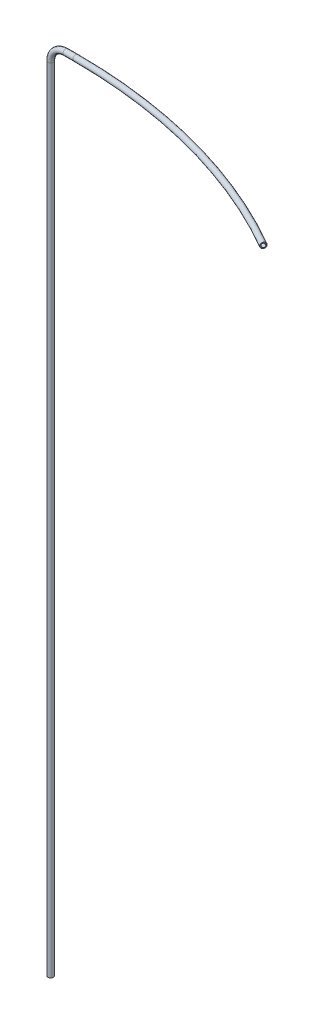
ISO-10303-21;
HEADER;
FILE_DESCRIPTION(('STEP AP214'),'2;1');
FILE_NAME('part.step','',(''),(''),'','','');
FILE_SCHEMA(('AUTOMOTIVE_DESIGN { 1 0 10303 214 1 1 1 1 }'));
ENDSEC;
DATA;
#1=APPLICATION_CONTEXT('core data for automotive mechanical design processes');
#2=APPLICATION_PROTOCOL_DEFINITION('international standard','automotive_design',2000,#1);
#3=PRODUCT_CONTEXT('',#1,'mechanical');
#4=PRODUCT('Part','Part','',(#3));
#5=PRODUCT_RELATED_PRODUCT_CATEGORY('part','',(#4));
#6=PRODUCT_DEFINITION_FORMATION('','',#4);
#7=PRODUCT_DEFINITION_CONTEXT('part definition',#1,'design');
#8=PRODUCT_DEFINITION('design','',#6,#7);
#9=PRODUCT_DEFINITION_SHAPE('','',#8);
#10=(LENGTH_UNIT() NAMED_UNIT(*) SI_UNIT(.MILLI.,.METRE.));
#11=(NAMED_UNIT(*) PLANE_ANGLE_UNIT() SI_UNIT($,.RADIAN.));
#12=(NAMED_UNIT(*) SI_UNIT($,.STERADIAN.) SOLID_ANGLE_UNIT());
#13=UNCERTAINTY_MEASURE_WITH_UNIT(LENGTH_MEASURE(1.E-05),#10,'distance_accuracy_value','');
#14=(GEOMETRIC_REPRESENTATION_CONTEXT(3) GLOBAL_UNCERTAINTY_ASSIGNED_CONTEXT((#13)) GLOBAL_UNIT_ASSIGNED_CONTEXT((#10,
#11,#12)) REPRESENTATION_CONTEXT('',''));
#15=CARTESIAN_POINT('',(0.,0.,0.));
#16=DIRECTION('',(0.,0.,1.));
#17=DIRECTION('',(1.,0.,0.));
#18=AXIS2_PLACEMENT_3D('',#15,#16,#17);
#19=CARTESIAN_POINT('',(0.,-0.371055821718923,-200.));
#20=DIRECTION('',(0.,1.,0.));
#21=DIRECTION('',(0.,0.,1.));
#22=AXIS2_PLACEMENT_3D('',#19,#20,#21);
#23=TOROIDAL_SURFACE('',#22,1100.,6.0000000000001);
#24=CARTESIAN_POINT('',(550.000000000001,-0.371055821718923,-1152.62794416288));
#25=DIRECTION('',(0.866025403784438,0.,0.500000000000001));
#26=DIRECTION('',(0.500000000000001,0.,-0.866025403784438));
#27=AXIS2_PLACEMENT_3D('',#24,#25,#26);
#28=CIRCLE('',#27,6.0000000000001);
#29=CARTESIAN_POINT('',(553.000000000001,-0.371055821718923,-1157.82409658559));
#30=VERTEX_POINT('',#29);
#31=EDGE_CURVE('E49',#30,#30,#28,.T.);
#32=CARTESIAN_POINT('',(0.,-0.371055821718923,-1300.));
#33=DIRECTION('',(-1.,0.,0.));
#34=DIRECTION('',(0.,0.,1.));
#35=AXIS2_PLACEMENT_3D('',#32,#33,#34);
#36=CIRCLE('',#35,6.0000000000001);
#37=CARTESIAN_POINT('',(0.,-0.371055821718923,-1306.));
#38=VERTEX_POINT('',#37);
#39=EDGE_CURVE('E66',#38,#38,#36,.T.);
#40=CARTESIAN_POINT('',(0.,-0.371055821718923,-200.));
#41=DIRECTION('',(0.,1.,0.));
#42=DIRECTION('',(0.,0.,1.));
#43=AXIS2_PLACEMENT_3D('',#40,#41,#42);
#44=CIRCLE('',#43,1106.);
#45=EDGE_CURVE('',#30,#38,#44,.T.);
#46=ORIENTED_EDGE('',*,*,#31,.F.);
#47=ORIENTED_EDGE('',*,*,#39,.F.);
#48=ORIENTED_EDGE('',*,*,#45,.T.);
#49=ORIENTED_EDGE('',*,*,#45,.F.);
#50=EDGE_LOOP('',(#46,#48,#47,#49));
#51=FACE_BOUND('',#50,.T.);
#52=ADVANCED_FACE('F41',(#51),#23,.T.);
#53=CARTESIAN_POINT('',(0.,-0.371055821718923,-200.));
#54=DIRECTION('',(0.,1.,0.));
#55=DIRECTION('',(0.,0.,1.));
#56=AXIS2_PLACEMENT_3D('',#53,#54,#55);
#57=TOROIDAL_SURFACE('',#56,1100.,3.99999999999999);
#58=CARTESIAN_POINT('',(550.000000000001,-0.371055821718923,-1152.62794416288));
#59=DIRECTION('',(0.866025403784438,0.,0.500000000000001));
#60=DIRECTION('',(0.500000000000001,0.,-0.866025403784438));
#61=AXIS2_PLACEMENT_3D('',#58,#59,#60);
#62=CIRCLE('',#61,3.99999999999999);
#63=CARTESIAN_POINT('',(552.000000000001,-0.371055821718923,-1156.09204577802));
#64=VERTEX_POINT('',#63);
#65=EDGE_CURVE('E10',#64,#64,#62,.T.);
#66=CARTESIAN_POINT('',(0.,-0.371055821718923,-1300.));
#67=DIRECTION('',(1.,0.,0.));
#68=DIRECTION('',(0.,0.,-1.));
#69=AXIS2_PLACEMENT_3D('',#66,#67,#68);
#70=CIRCLE('',#69,3.99999999999999);
#71=CARTESIAN_POINT('',(0.,-0.371055821718923,-1304.));
#72=VERTEX_POINT('',#71);
#73=EDGE_CURVE('E54',#72,#72,#70,.T.);
#74=CARTESIAN_POINT('',(0.,-0.371055821718923,-200.));
#75=DIRECTION('',(0.,1.,0.));
#76=DIRECTION('',(0.,0.,1.));
#77=AXIS2_PLACEMENT_3D('',#74,#75,#76);
#78=CIRCLE('',#77,1104.);
#79=EDGE_CURVE('',#64,#72,#78,.T.);
#80=ORIENTED_EDGE('',*,*,#65,.T.);
#81=ORIENTED_EDGE('',*,*,#73,.F.);
#82=ORIENTED_EDGE('',*,*,#79,.T.);
#83=ORIENTED_EDGE('',*,*,#79,.F.);
#84=EDGE_LOOP('',(#80,#82,#81,#83));
#85=FACE_BOUND('',#84,.T.);
#86=ADVANCED_FACE('F43',(#85),#57,.F.);
#87=CARTESIAN_POINT('',(-100.,0.,-26.7949192431124));
#88=DIRECTION('',(0.866025403784438,0.,0.500000000000001));
#89=DIRECTION('',(0.500000000000001,0.,-0.866025403784438));
#90=AXIS2_PLACEMENT_3D('',#87,#88,#89);
#91=PLANE('',#90);
#92=ORIENTED_EDGE('',*,*,#31,.T.);
#93=EDGE_LOOP('',(#92));
#94=FACE_BOUND('',#93,.T.);
#95=ORIENTED_EDGE('',*,*,#65,.F.);
#96=EDGE_LOOP('',(#95));
#97=FACE_BOUND('',#96,.T.);
#98=ADVANCED_FACE('F103',(#94,#97),#91,.T.);
#99=CARTESIAN_POINT('',(0.,-0.371055821718923,-1300.));
#100=DIRECTION('',(-1.,0.,0.));
#101=DIRECTION('',(0.,0.,1.));
#102=AXIS2_PLACEMENT_3D('',#99,#100,#101);
#103=CYLINDRICAL_SURFACE('',#102,6.0000000000001);
#104=CARTESIAN_POINT('',(-21.3411325230505,-0.371055821718923,-1300.));
#105=DIRECTION('',(-1.,0.,0.));
#106=DIRECTION('',(0.,0.,1.));
#107=AXIS2_PLACEMENT_3D('',#104,#105,#106);
#108=CIRCLE('',#107,6.0000000000001);
#109=CARTESIAN_POINT('',(-21.3411325230505,5.62894417828116,-1300.));
#110=VERTEX_POINT('',#109);
#111=EDGE_CURVE('E67',#110,#110,#108,.T.);
#112=ORIENTED_EDGE('',*,*,#111,.F.);
#113=EDGE_LOOP('',(#112));
#114=FACE_BOUND('',#113,.T.);
#115=ORIENTED_EDGE('',*,*,#39,.T.);
#116=EDGE_LOOP('',(#115));
#117=FACE_BOUND('',#116,.T.);
#118=ADVANCED_FACE('F96',(#114,#117),#103,.T.);
#119=CARTESIAN_POINT('',(-21.3411325230505,-32.7422911892462,-1300.));
#120=DIRECTION('',(0.,0.,1.));
#121=DIRECTION('',(1.,0.,0.));
#122=AXIS2_PLACEMENT_3D('',#119,#120,#121);
#123=TOROIDAL_SURFACE('',#122,32.3712353675273,6.0000000000001);
#124=CARTESIAN_POINT('',(-53.7123678905778,-32.7422911892462,-1300.));
#125=DIRECTION('',(0.,-1.,0.));
#126=DIRECTION('',(0.,0.,1.));
#127=AXIS2_PLACEMENT_3D('',#124,#125,#126);
#128=CIRCLE('',#127,6.0000000000001);
#129=CARTESIAN_POINT('',(-59.7123678905779,-32.7422911892462,-1300.));
#130=VERTEX_POINT('',#129);
#131=EDGE_CURVE('E62',#130,#130,#128,.T.);
#132=CARTESIAN_POINT('',(-21.3411325230505,-32.7422911892462,-1300.));
#133=DIRECTION('',(0.,0.,1.));
#134=DIRECTION('',(1.,0.,0.));
#135=AXIS2_PLACEMENT_3D('',#132,#133,#134);
#136=CIRCLE('',#135,38.3712353675274);
#137=EDGE_CURVE('',#110,#130,#136,.T.);
#138=ORIENTED_EDGE('',*,*,#111,.T.);
#139=ORIENTED_EDGE('',*,*,#131,.F.);
#140=ORIENTED_EDGE('',*,*,#137,.T.);
#141=ORIENTED_EDGE('',*,*,#137,.F.);
#142=EDGE_LOOP('',(#138,#140,#139,#141));
#143=FACE_BOUND('',#142,.T.);
#144=ADVANCED_FACE('F106',(#143),#123,.T.);
#145=CARTESIAN_POINT('',(-53.7123678905778,-32.7422911892462,-1300.));
#146=DIRECTION('',(0.,-1.,0.));
#147=DIRECTION('',(1.,0.,0.));
#148=AXIS2_PLACEMENT_3D('',#145,#146,#147);
#149=CYLINDRICAL_SURFACE('',#148,6.0000000000001);
#150=ORIENTED_EDGE('',*,*,#131,.T.);
#151=EDGE_LOOP('',(#150));
#152=FACE_BOUND('',#151,.T.);
#153=CARTESIAN_POINT('',(-53.712367890578,-1732.74229118925,-1300.));
#154=DIRECTION('',(0.,-1.,0.));
#155=DIRECTION('',(1.,0.,0.));
#156=AXIS2_PLACEMENT_3D('',#153,#154,#155);
#157=CIRCLE('',#156,6.00000000000001);
#158=CARTESIAN_POINT('',(-47.712367890578,-1732.74229118925,-1300.));
#159=VERTEX_POINT('',#158);
#160=EDGE_CURVE('E71',#159,#159,#157,.T.);
#161=ORIENTED_EDGE('',*,*,#160,.F.);
#162=EDGE_LOOP('',(#161));
#163=FACE_BOUND('',#162,.T.);
#164=ADVANCED_FACE('F118',(#152,#163),#149,.T.);
#165=CARTESIAN_POINT('',(0.,-0.371055821718923,-1300.));
#166=DIRECTION('',(-1.,0.,0.));
#167=DIRECTION('',(0.,0.,1.));
#168=AXIS2_PLACEMENT_3D('',#165,#166,#167);
#169=CYLINDRICAL_SURFACE('',#168,3.99999999999999);
#170=CARTESIAN_POINT('',(-21.3411325230505,-0.371055821718923,-1300.));
#171=DIRECTION('',(-1.,0.,0.));
#172=DIRECTION('',(0.,0.,1.));
#173=AXIS2_PLACEMENT_3D('',#170,#171,#172);
#174=CIRCLE('',#173,3.99999999999999);
#175=CARTESIAN_POINT('',(-21.3411325230505,3.62894417828106,-1300.));
#176=VERTEX_POINT('',#175);
#177=EDGE_CURVE('E75',#176,#176,#174,.F.);
#178=ORIENTED_EDGE('',*,*,#177,.F.);
#179=EDGE_LOOP('',(#178));
#180=FACE_BOUND('',#179,.T.);
#181=ORIENTED_EDGE('',*,*,#73,.T.);
#182=EDGE_LOOP('',(#181));
#183=FACE_BOUND('',#182,.T.);
#184=ADVANCED_FACE('F121',(#180,#183),#169,.F.);
#185=CARTESIAN_POINT('',(-21.3411325230505,-32.7422911892462,-1300.));
#186=DIRECTION('',(0.,0.,1.));
#187=DIRECTION('',(1.,0.,0.));
#188=AXIS2_PLACEMENT_3D('',#185,#186,#187);
#189=TOROIDAL_SURFACE('',#188,32.3712353675273,3.99999999999999);
#190=CARTESIAN_POINT('',(-53.7123678905778,-32.7422911892462,-1300.));
#191=DIRECTION('',(0.,-1.,0.));
#192=DIRECTION('',(0.,0.,1.));
#193=AXIS2_PLACEMENT_3D('',#190,#191,#192);
#194=CIRCLE('',#193,3.99999999999999);
#195=CARTESIAN_POINT('',(-57.7123678905778,-32.7422911892462,-1300.));
#196=VERTEX_POINT('',#195);
#197=EDGE_CURVE('E59',#196,#196,#194,.F.);
#198=CARTESIAN_POINT('',(-21.3411325230505,-32.7422911892462,-1300.));
#199=DIRECTION('',(0.,0.,1.));
#200=DIRECTION('',(1.,0.,0.));
#201=AXIS2_PLACEMENT_3D('',#198,#199,#200);
#202=CIRCLE('',#201,36.3712353675273);
#203=EDGE_CURVE('',#176,#196,#202,.T.);
#204=ORIENTED_EDGE('',*,*,#177,.T.);
#205=ORIENTED_EDGE('',*,*,#197,.F.);
#206=ORIENTED_EDGE('',*,*,#203,.T.);
#207=ORIENTED_EDGE('',*,*,#203,.F.);
#208=EDGE_LOOP('',(#204,#206,#205,#207));
#209=FACE_BOUND('',#208,.T.);
#210=ADVANCED_FACE('F100',(#209),#189,.F.);
#211=CARTESIAN_POINT('',(-53.7123678905778,-32.7422911892462,-1300.));
#212=DIRECTION('',(0.,-1.,0.));
#213=DIRECTION('',(1.,0.,0.));
#214=AXIS2_PLACEMENT_3D('',#211,#212,#213);
#215=CYLINDRICAL_SURFACE('',#214,3.99999999999999);
#216=ORIENTED_EDGE('',*,*,#197,.T.);
#217=EDGE_LOOP('',(#216));
#218=FACE_BOUND('',#217,.T.);
#219=CARTESIAN_POINT('',(-53.712367890578,-1732.74229118925,-1300.));
#220=DIRECTION('',(0.,-1.,0.));
#221=DIRECTION('',(1.,0.,0.));
#222=AXIS2_PLACEMENT_3D('',#219,#220,#221);
#223=CIRCLE('',#222,4.00000000000001);
#224=CARTESIAN_POINT('',(-49.712367890578,-1732.74229118925,-1300.));
#225=VERTEX_POINT('',#224);
#226=EDGE_CURVE('E85',#225,#225,#223,.T.);
#227=ORIENTED_EDGE('',*,*,#226,.T.);
#228=EDGE_LOOP('',(#227));
#229=FACE_BOUND('',#228,.T.);
#230=ADVANCED_FACE('F90',(#218,#229),#215,.F.);
#231=CARTESIAN_POINT('',(-53.712367890578,-1732.74229118925,-1300.));
#232=DIRECTION('',(0.,-1.,0.));
#233=DIRECTION('',(1.,0.,0.));
#234=AXIS2_PLACEMENT_3D('',#231,#232,#233);
#235=PLANE('',#234);
#236=ORIENTED_EDGE('',*,*,#160,.T.);
#237=EDGE_LOOP('',(#236));
#238=FACE_BOUND('',#237,.T.);
#239=ORIENTED_EDGE('',*,*,#226,.F.);
#240=EDGE_LOOP('',(#239));
#241=FACE_BOUND('',#240,.T.);
#242=ADVANCED_FACE('F92',(#238,#241),#235,.T.);
#243=CLOSED_SHELL('',(#52,#86,#98,#118,#144,#164,#184,#210,#230,#242));
#244=MANIFOLD_SOLID_BREP('B2',#243);
#245=ADVANCED_BREP_SHAPE_REPRESENTATION('',(#18,#244),#14);
#246=SHAPE_DEFINITION_REPRESENTATION(#9,#245);
ENDSEC;
END-ISO-10303-21;
